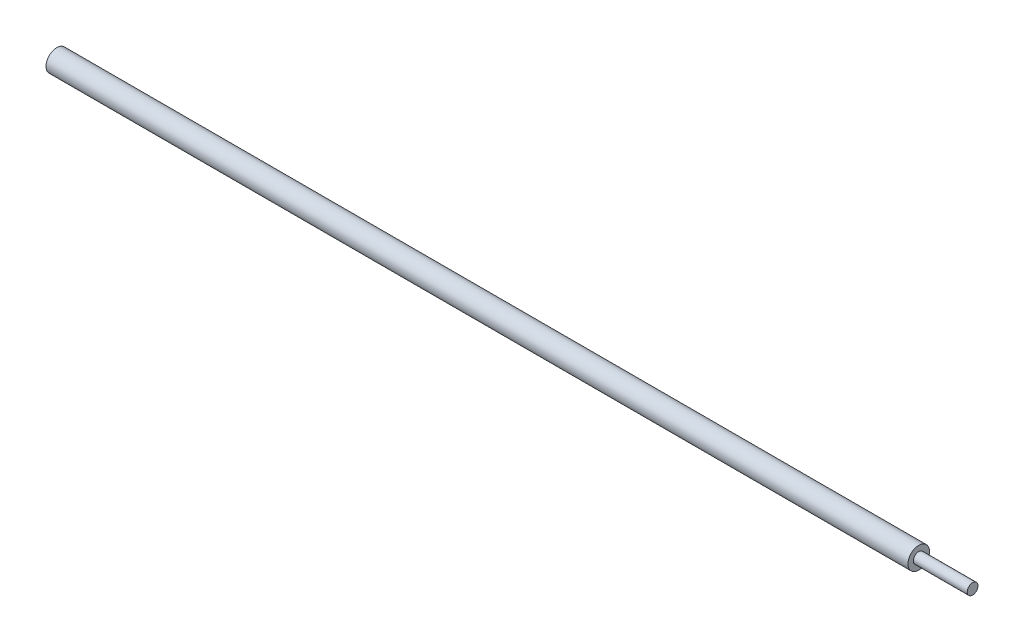
ISO-10303-21;
HEADER;
FILE_DESCRIPTION(('STEP AP214'),'2;1');
FILE_NAME('part.step','',(''),(''),'','','');
FILE_SCHEMA(('AUTOMOTIVE_DESIGN { 1 0 10303 214 1 1 1 1 }'));
ENDSEC;
DATA;
#1=APPLICATION_CONTEXT('core data for automotive mechanical design processes');
#2=APPLICATION_PROTOCOL_DEFINITION('international standard','automotive_design',2000,#1);
#3=PRODUCT_CONTEXT('',#1,'mechanical');
#4=PRODUCT('Part','Part','',(#3));
#5=PRODUCT_RELATED_PRODUCT_CATEGORY('part','',(#4));
#6=PRODUCT_DEFINITION_FORMATION('','',#4);
#7=PRODUCT_DEFINITION_CONTEXT('part definition',#1,'design');
#8=PRODUCT_DEFINITION('design','',#6,#7);
#9=PRODUCT_DEFINITION_SHAPE('','',#8);
#10=(LENGTH_UNIT() NAMED_UNIT(*) SI_UNIT(.MILLI.,.METRE.));
#11=(NAMED_UNIT(*) PLANE_ANGLE_UNIT() SI_UNIT($,.RADIAN.));
#12=(NAMED_UNIT(*) SI_UNIT($,.STERADIAN.) SOLID_ANGLE_UNIT());
#13=UNCERTAINTY_MEASURE_WITH_UNIT(LENGTH_MEASURE(1.E-05),#10,'distance_accuracy_value','');
#14=(GEOMETRIC_REPRESENTATION_CONTEXT(3) GLOBAL_UNCERTAINTY_ASSIGNED_CONTEXT((#13)) GLOBAL_UNIT_ASSIGNED_CONTEXT((#10,
#11,#12)) REPRESENTATION_CONTEXT('',''));
#15=CARTESIAN_POINT('',(0.,0.,0.));
#16=DIRECTION('',(0.,0.,1.));
#17=DIRECTION('',(1.,0.,0.));
#18=AXIS2_PLACEMENT_3D('',#15,#16,#17);
#19=CARTESIAN_POINT('',(-36.7146058363154,0.,0.));
#20=DIRECTION('',(-1.,0.,0.));
#21=DIRECTION('',(0.,0.,1.));
#22=AXIS2_PLACEMENT_3D('',#19,#20,#21);
#23=CYLINDRICAL_SURFACE('',#22,1.);
#24=CARTESIAN_POINT('',(43.2853941636846,0.,0.));
#25=DIRECTION('',(-1.,0.,0.));
#26=DIRECTION('',(0.,0.,1.));
#27=AXIS2_PLACEMENT_3D('',#24,#25,#26);
#28=CIRCLE('',#27,1.);
#29=CARTESIAN_POINT('',(43.2853941636846,0.,1.));
#30=VERTEX_POINT('',#29);
#31=EDGE_CURVE('E52',#30,#30,#28,.T.);
#32=ORIENTED_EDGE('',*,*,#31,.T.);
#33=EDGE_LOOP('',(#32));
#34=FACE_BOUND('',#33,.T.);
#35=CARTESIAN_POINT('',(-36.7146058363154,0.,0.));
#36=DIRECTION('',(-1.,0.,0.));
#37=DIRECTION('',(0.,0.,1.));
#38=AXIS2_PLACEMENT_3D('',#35,#36,#37);
#39=CIRCLE('',#38,1.);
#40=CARTESIAN_POINT('',(-36.7146058363154,0.,1.));
#41=VERTEX_POINT('',#40);
#42=EDGE_CURVE('E42',#41,#41,#39,.T.);
#43=ORIENTED_EDGE('',*,*,#42,.F.);
#44=EDGE_LOOP('',(#43));
#45=FACE_BOUND('',#44,.T.);
#46=ADVANCED_FACE('F39',(#34,#45),#23,.T.);
#47=CARTESIAN_POINT('',(-36.7146058363154,-1.,0.));
#48=DIRECTION('',(1.,0.,0.));
#49=DIRECTION('',(0.,0.,-1.));
#50=AXIS2_PLACEMENT_3D('',#47,#48,#49);
#51=PLANE('',#50);
#52=ORIENTED_EDGE('',*,*,#42,.T.);
#53=EDGE_LOOP('',(#52));
#54=FACE_BOUND('',#53,.T.);
#55=ADVANCED_FACE('F74',(#54),#51,.F.);
#56=CARTESIAN_POINT('',(43.2853941636846,0.,0.));
#57=DIRECTION('',(-1.,0.,0.));
#58=DIRECTION('',(0.,0.,1.));
#59=AXIS2_PLACEMENT_3D('',#56,#57,#58);
#60=PLANE('',#59);
#61=CARTESIAN_POINT('',(43.2853941636846,0.,0.));
#62=DIRECTION('',(1.,0.,0.));
#63=DIRECTION('',(0.,0.,-1.));
#64=AXIS2_PLACEMENT_3D('',#61,#62,#63);
#65=CIRCLE('',#64,0.5);
#66=CARTESIAN_POINT('',(43.2853941636846,0.,-0.5));
#67=VERTEX_POINT('',#66);
#68=EDGE_CURVE('E10',#67,#67,#65,.T.);
#69=ORIENTED_EDGE('',*,*,#68,.F.);
#70=EDGE_LOOP('',(#69));
#71=FACE_BOUND('',#70,.T.);
#72=ORIENTED_EDGE('',*,*,#31,.F.);
#73=EDGE_LOOP('',(#72));
#74=FACE_BOUND('',#73,.T.);
#75=ADVANCED_FACE('F67',(#71,#74),#60,.F.);
#76=CARTESIAN_POINT('',(48.2853941636846,0.,0.));
#77=DIRECTION('',(-1.,0.,0.));
#78=DIRECTION('',(0.,0.,1.));
#79=AXIS2_PLACEMENT_3D('',#76,#77,#78);
#80=CYLINDRICAL_SURFACE('',#79,0.5);
#81=CARTESIAN_POINT('',(48.2853941636846,0.,0.));
#82=DIRECTION('',(1.,0.,0.));
#83=DIRECTION('',(0.,0.,-1.));
#84=AXIS2_PLACEMENT_3D('',#81,#82,#83);
#85=CIRCLE('',#84,0.5);
#86=CARTESIAN_POINT('',(48.2853941636846,0.,-0.5));
#87=VERTEX_POINT('',#86);
#88=EDGE_CURVE('E54',#87,#87,#85,.T.);
#89=ORIENTED_EDGE('',*,*,#88,.F.);
#90=EDGE_LOOP('',(#89));
#91=FACE_BOUND('',#90,.T.);
#92=ORIENTED_EDGE('',*,*,#68,.T.);
#93=EDGE_LOOP('',(#92));
#94=FACE_BOUND('',#93,.T.);
#95=ADVANCED_FACE('F65',(#91,#94),#80,.T.);
#96=CARTESIAN_POINT('',(48.2853941636846,0.,0.));
#97=DIRECTION('',(1.,0.,0.));
#98=DIRECTION('',(0.,0.,-1.));
#99=AXIS2_PLACEMENT_3D('',#96,#97,#98);
#100=PLANE('',#99);
#101=ORIENTED_EDGE('',*,*,#88,.T.);
#102=EDGE_LOOP('',(#101));
#103=FACE_BOUND('',#102,.T.);
#104=ADVANCED_FACE('F63',(#103),#100,.T.);
#105=CLOSED_SHELL('',(#46,#55,#75,#95,#104));
#106=MANIFOLD_SOLID_BREP('B2',#105);
#107=ADVANCED_BREP_SHAPE_REPRESENTATION('',(#18,#106),#14);
#108=SHAPE_DEFINITION_REPRESENTATION(#9,#107);
ENDSEC;
END-ISO-10303-21;
